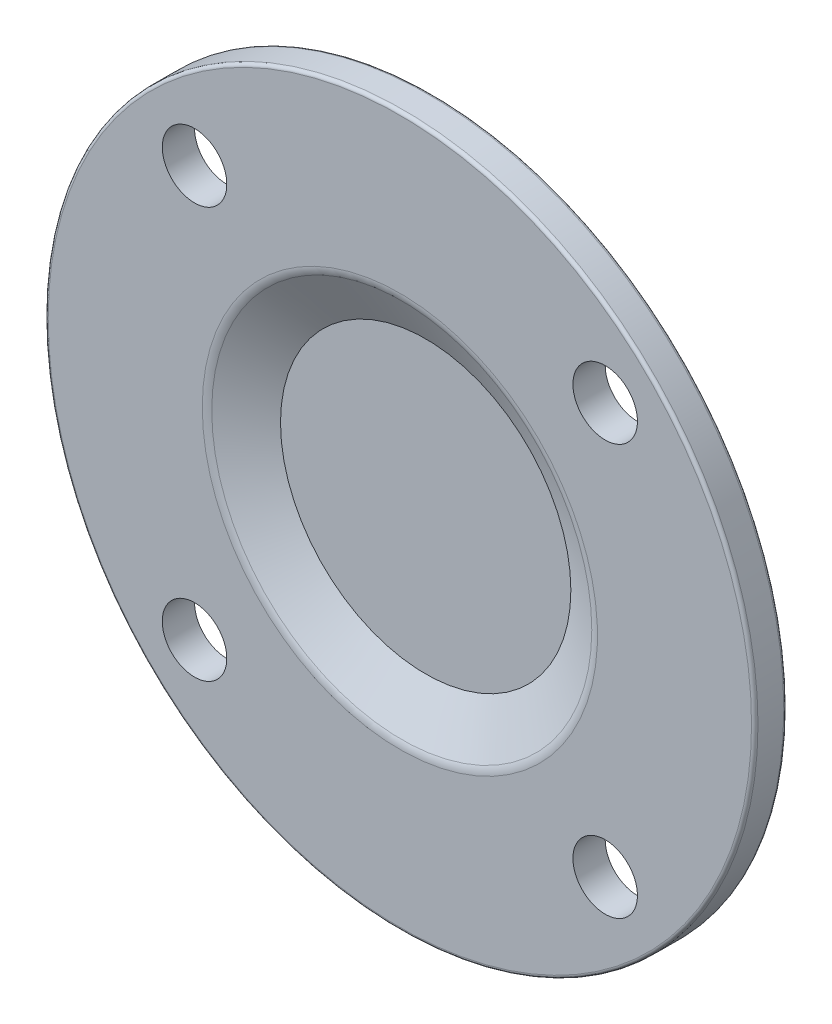
ISO-10303-21;
HEADER;
FILE_DESCRIPTION(('STEP AP214'),'2;1');
FILE_NAME('part.step','',(''),(''),'','','');
FILE_SCHEMA(('AUTOMOTIVE_DESIGN { 1 0 10303 214 1 1 1 1 }'));
ENDSEC;
DATA;
#1=APPLICATION_CONTEXT('core data for automotive mechanical design processes');
#2=APPLICATION_PROTOCOL_DEFINITION('international standard','automotive_design',2000,#1);
#3=PRODUCT_CONTEXT('',#1,'mechanical');
#4=PRODUCT('Part','Part','',(#3));
#5=PRODUCT_RELATED_PRODUCT_CATEGORY('part','',(#4));
#6=PRODUCT_DEFINITION_FORMATION('','',#4);
#7=PRODUCT_DEFINITION_CONTEXT('part definition',#1,'design');
#8=PRODUCT_DEFINITION('design','',#6,#7);
#9=PRODUCT_DEFINITION_SHAPE('','',#8);
#10=(LENGTH_UNIT() NAMED_UNIT(*) SI_UNIT(.MILLI.,.METRE.));
#11=(NAMED_UNIT(*) PLANE_ANGLE_UNIT() SI_UNIT($,.RADIAN.));
#12=(NAMED_UNIT(*) SI_UNIT($,.STERADIAN.) SOLID_ANGLE_UNIT());
#13=UNCERTAINTY_MEASURE_WITH_UNIT(LENGTH_MEASURE(1.E-05),#10,'distance_accuracy_value','');
#14=(GEOMETRIC_REPRESENTATION_CONTEXT(3) GLOBAL_UNCERTAINTY_ASSIGNED_CONTEXT((#13)) GLOBAL_UNIT_ASSIGNED_CONTEXT((#10,
#11,#12)) REPRESENTATION_CONTEXT('',''));
#15=CARTESIAN_POINT('',(0.,0.,0.));
#16=DIRECTION('',(0.,0.,1.));
#17=DIRECTION('',(1.,0.,0.));
#18=AXIS2_PLACEMENT_3D('',#15,#16,#17);
#19=CARTESIAN_POINT('',(0.,0.,0.));
#20=DIRECTION('',(0.,0.,1.));
#21=DIRECTION('',(1.,0.,0.));
#22=AXIS2_PLACEMENT_3D('',#19,#20,#21);
#23=CYLINDRICAL_SURFACE('',#22,11.);
#24=CARTESIAN_POINT('',(0.,0.,-0.1));
#25=DIRECTION('',(0.,0.,-1.));
#26=DIRECTION('',(-1.,0.,0.));
#27=AXIS2_PLACEMENT_3D('',#24,#25,#26);
#28=CIRCLE('',#27,11.);
#29=CARTESIAN_POINT('',(-11.,0.,-0.1));
#30=VERTEX_POINT('',#29);
#31=EDGE_CURVE('E37',#30,#30,#28,.T.);
#32=ORIENTED_EDGE('',*,*,#31,.T.);
#33=EDGE_LOOP('',(#32));
#34=FACE_BOUND('',#33,.T.);
#35=CARTESIAN_POINT('',(0.,0.,-0.9));
#36=DIRECTION('',(0.,0.,1.));
#37=DIRECTION('',(1.,0.,0.));
#38=AXIS2_PLACEMENT_3D('',#35,#36,#37);
#39=CIRCLE('',#38,11.);
#40=CARTESIAN_POINT('',(11.,0.,-0.9));
#41=VERTEX_POINT('',#40);
#42=EDGE_CURVE('E41',#41,#41,#39,.T.);
#43=ORIENTED_EDGE('',*,*,#42,.T.);
#44=EDGE_LOOP('',(#43));
#45=FACE_BOUND('',#44,.T.);
#46=ADVANCED_FACE('F30',(#34,#45),#23,.T.);
#47=CARTESIAN_POINT('',(0.,11.,-1.));
#48=DIRECTION('',(0.,0.,1.));
#49=DIRECTION('',(1.,0.,0.));
#50=AXIS2_PLACEMENT_3D('',#47,#48,#49);
#51=PLANE('',#50);
#52=CARTESIAN_POINT('',(0.,0.,-1.));
#53=DIRECTION('',(0.,0.,1.));
#54=DIRECTION('',(1.,0.,0.));
#55=AXIS2_PLACEMENT_3D('',#52,#53,#54);
#56=CIRCLE('',#55,10.9);
#57=CARTESIAN_POINT('',(10.9,0.,-1.));
#58=VERTEX_POINT('',#57);
#59=EDGE_CURVE('E10',#58,#58,#56,.F.);
#60=ORIENTED_EDGE('',*,*,#59,.T.);
#61=EDGE_LOOP('',(#60));
#62=FACE_BOUND('',#61,.T.);
#63=CARTESIAN_POINT('',(6.36396103067894,6.36396103067856,-1.));
#64=DIRECTION('',(0.,0.,-1.));
#65=DIRECTION('',(-1.,0.,0.));
#66=AXIS2_PLACEMENT_3D('',#63,#64,#65);
#67=CIRCLE('',#66,1.00000000000038);
#68=CARTESIAN_POINT('',(5.36396103067855,6.36396103067856,-1.));
#69=VERTEX_POINT('',#68);
#70=EDGE_CURVE('E78',#69,#69,#67,.T.);
#71=ORIENTED_EDGE('',*,*,#70,.F.);
#72=EDGE_LOOP('',(#71));
#73=FACE_BOUND('',#72,.T.);
#74=CARTESIAN_POINT('',(6.36396103067856,-6.36396103067929,-1.));
#75=DIRECTION('',(0.,0.,-1.));
#76=DIRECTION('',(-1.,0.,0.));
#77=AXIS2_PLACEMENT_3D('',#74,#75,#76);
#78=CIRCLE('',#77,1.00000000000026);
#79=CARTESIAN_POINT('',(5.36396103067829,-6.36396103067929,-1.));
#80=VERTEX_POINT('',#79);
#81=EDGE_CURVE('E84',#80,#80,#78,.T.);
#82=ORIENTED_EDGE('',*,*,#81,.F.);
#83=EDGE_LOOP('',(#82));
#84=FACE_BOUND('',#83,.T.);
#85=CARTESIAN_POINT('',(-6.36396103067929,-6.36396103067891,-1.));
#86=DIRECTION('',(0.,0.,-1.));
#87=DIRECTION('',(-1.,0.,0.));
#88=AXIS2_PLACEMENT_3D('',#85,#86,#87);
#89=CIRCLE('',#88,0.999999999999913);
#90=CARTESIAN_POINT('',(-7.3639610306792,-6.36396103067891,-1.));
#91=VERTEX_POINT('',#90);
#92=EDGE_CURVE('E90',#91,#91,#89,.T.);
#93=ORIENTED_EDGE('',*,*,#92,.F.);
#94=EDGE_LOOP('',(#93));
#95=FACE_BOUND('',#94,.T.);
#96=CARTESIAN_POINT('',(-6.36396103067892,6.36396103067894,-1.));
#97=DIRECTION('',(0.,0.,-1.));
#98=DIRECTION('',(-1.,0.,0.));
#99=AXIS2_PLACEMENT_3D('',#96,#97,#98);
#100=CIRCLE('',#99,1.);
#101=CARTESIAN_POINT('',(-7.36396103067892,6.36396103067894,-1.));
#102=VERTEX_POINT('',#101);
#103=EDGE_CURVE('E72',#102,#102,#100,.T.);
#104=ORIENTED_EDGE('',*,*,#103,.F.);
#105=EDGE_LOOP('',(#104));
#106=FACE_BOUND('',#105,.T.);
#107=CARTESIAN_POINT('',(0.,0.,-1.));
#108=DIRECTION('',(0.,0.,1.));
#109=DIRECTION('',(1.,0.,0.));
#110=AXIS2_PLACEMENT_3D('',#107,#108,#109);
#111=CIRCLE('',#110,6.125);
#112=CARTESIAN_POINT('',(6.125,0.,-1.));
#113=VERTEX_POINT('',#112);
#114=EDGE_CURVE('E59',#113,#113,#111,.T.);
#115=ORIENTED_EDGE('',*,*,#114,.T.);
#116=EDGE_LOOP('',(#115));
#117=FACE_BOUND('',#116,.T.);
#118=ADVANCED_FACE('F107',(#62,#73,#84,#95,#106,#117),#51,.F.);
#119=CARTESIAN_POINT('',(0.,0.,-1.8));
#120=DIRECTION('',(0.,0.,1.));
#121=DIRECTION('',(1.,0.,0.));
#122=AXIS2_PLACEMENT_3D('',#119,#120,#121);
#123=CONICAL_SURFACE('',#122,4.5,1.08083900054117);
#124=CARTESIAN_POINT('',(0.,0.,-1.05882352941177));
#125=DIRECTION('',(0.,0.,1.));
#126=DIRECTION('',(1.,0.,0.));
#127=AXIS2_PLACEMENT_3D('',#124,#125,#126);
#128=CIRCLE('',#127,5.88970588235294);
#129=CARTESIAN_POINT('',(5.88970588235294,0.,-1.05882352941177));
#130=VERTEX_POINT('',#129);
#131=EDGE_CURVE('E53',#130,#130,#128,.F.);
#132=ORIENTED_EDGE('',*,*,#131,.T.);
#133=EDGE_LOOP('',(#132));
#134=FACE_BOUND('',#133,.T.);
#135=CARTESIAN_POINT('',(0.,0.,-1.74117647058824));
#136=DIRECTION('',(0.,0.,-1.));
#137=DIRECTION('',(-1.,0.,0.));
#138=AXIS2_PLACEMENT_3D('',#135,#136,#137);
#139=CIRCLE('',#138,4.61029411764706);
#140=CARTESIAN_POINT('',(-4.61029411764706,0.,-1.74117647058824));
#141=VERTEX_POINT('',#140);
#142=EDGE_CURVE('E56',#141,#141,#139,.F.);
#143=ORIENTED_EDGE('',*,*,#142,.T.);
#144=EDGE_LOOP('',(#143));
#145=FACE_BOUND('',#144,.T.);
#146=ADVANCED_FACE('F110',(#134,#145),#123,.T.);
#147=CARTESIAN_POINT('',(0.,0.,-1.8));
#148=DIRECTION('',(0.,0.,1.));
#149=DIRECTION('',(1.,0.,0.));
#150=AXIS2_PLACEMENT_3D('',#147,#148,#149);
#151=PLANE('',#150);
#152=CARTESIAN_POINT('',(0.,0.,-1.8));
#153=DIRECTION('',(0.,0.,1.));
#154=DIRECTION('',(1.,0.,0.));
#155=AXIS2_PLACEMENT_3D('',#152,#153,#154);
#156=CIRCLE('',#155,4.375);
#157=CARTESIAN_POINT('',(4.375,0.,-1.8));
#158=VERTEX_POINT('',#157);
#159=EDGE_CURVE('E50',#158,#158,#156,.F.);
#160=ORIENTED_EDGE('',*,*,#159,.T.);
#161=EDGE_LOOP('',(#160));
#162=FACE_BOUND('',#161,.T.);
#163=ADVANCED_FACE('F139',(#162),#151,.F.);
#164=CARTESIAN_POINT('',(0.,0.,-0.800000000000001));
#165=DIRECTION('',(0.,0.,-1.));
#166=DIRECTION('',(-1.,0.,0.));
#167=AXIS2_PLACEMENT_3D('',#164,#165,#166);
#168=PLANE('',#167);
#169=CARTESIAN_POINT('',(0.,0.,-0.800000000000001));
#170=DIRECTION('',(0.,0.,1.));
#171=DIRECTION('',(1.,0.,0.));
#172=AXIS2_PLACEMENT_3D('',#169,#170,#171);
#173=CIRCLE('',#172,4.5);
#174=CARTESIAN_POINT('',(4.5,0.,-0.800000000000001));
#175=VERTEX_POINT('',#174);
#176=EDGE_CURVE('E68',#175,#175,#173,.T.);
#177=ORIENTED_EDGE('',*,*,#176,.T.);
#178=EDGE_LOOP('',(#177));
#179=FACE_BOUND('',#178,.T.);
#180=ADVANCED_FACE('F143',(#179),#168,.F.);
#181=CARTESIAN_POINT('',(0.,0.,0.));
#182=DIRECTION('',(0.,0.,1.));
#183=DIRECTION('',(1.,0.,0.));
#184=AXIS2_PLACEMENT_3D('',#181,#182,#183);
#185=CONICAL_SURFACE('',#184,6.,1.08083900054117);
#186=CARTESIAN_POINT('',(0.,0.,-0.0588235294117639));
#187=DIRECTION('',(0.,0.,-1.));
#188=DIRECTION('',(-1.,0.,0.));
#189=AXIS2_PLACEMENT_3D('',#186,#187,#188);
#190=CIRCLE('',#189,5.88970588235294);
#191=CARTESIAN_POINT('',(-5.88970588235294,0.,-0.0588235294117639));
#192=VERTEX_POINT('',#191);
#193=EDGE_CURVE('E65',#192,#192,#190,.F.);
#194=ORIENTED_EDGE('',*,*,#193,.T.);
#195=EDGE_LOOP('',(#194));
#196=FACE_BOUND('',#195,.T.);
#197=ORIENTED_EDGE('',*,*,#176,.F.);
#198=EDGE_LOOP('',(#197));
#199=FACE_BOUND('',#198,.T.);
#200=ADVANCED_FACE('F147',(#196,#199),#185,.F.);
#201=CARTESIAN_POINT('',(0.,11.,0.));
#202=DIRECTION('',(0.,0.,-1.));
#203=DIRECTION('',(-1.,0.,0.));
#204=AXIS2_PLACEMENT_3D('',#201,#202,#203);
#205=PLANE('',#204);
#206=CARTESIAN_POINT('',(0.,0.,0.));
#207=DIRECTION('',(0.,0.,-1.));
#208=DIRECTION('',(-1.,0.,0.));
#209=AXIS2_PLACEMENT_3D('',#206,#207,#208);
#210=CIRCLE('',#209,10.9);
#211=CARTESIAN_POINT('',(-10.9,0.,0.));
#212=VERTEX_POINT('',#211);
#213=EDGE_CURVE('E45',#212,#212,#210,.F.);
#214=ORIENTED_EDGE('',*,*,#213,.T.);
#215=EDGE_LOOP('',(#214));
#216=FACE_BOUND('',#215,.T.);
#217=CARTESIAN_POINT('',(6.36396103067894,6.36396103067856,0.));
#218=DIRECTION('',(0.,0.,-1.));
#219=DIRECTION('',(-1.,0.,0.));
#220=AXIS2_PLACEMENT_3D('',#217,#218,#219);
#221=CIRCLE('',#220,1.00000000000038);
#222=CARTESIAN_POINT('',(5.36396103067855,6.36396103067856,0.));
#223=VERTEX_POINT('',#222);
#224=EDGE_CURVE('E81',#223,#223,#221,.T.);
#225=ORIENTED_EDGE('',*,*,#224,.T.);
#226=EDGE_LOOP('',(#225));
#227=FACE_BOUND('',#226,.T.);
#228=CARTESIAN_POINT('',(6.36396103067856,-6.36396103067929,0.));
#229=DIRECTION('',(0.,0.,-1.));
#230=DIRECTION('',(-1.,0.,0.));
#231=AXIS2_PLACEMENT_3D('',#228,#229,#230);
#232=CIRCLE('',#231,1.00000000000026);
#233=CARTESIAN_POINT('',(5.36396103067829,-6.36396103067929,0.));
#234=VERTEX_POINT('',#233);
#235=EDGE_CURVE('E87',#234,#234,#232,.T.);
#236=ORIENTED_EDGE('',*,*,#235,.T.);
#237=EDGE_LOOP('',(#236));
#238=FACE_BOUND('',#237,.T.);
#239=CARTESIAN_POINT('',(-6.36396103067929,-6.36396103067891,0.));
#240=DIRECTION('',(0.,0.,-1.));
#241=DIRECTION('',(-1.,0.,0.));
#242=AXIS2_PLACEMENT_3D('',#239,#240,#241);
#243=CIRCLE('',#242,0.999999999999913);
#244=CARTESIAN_POINT('',(-7.3639610306792,-6.36396103067891,0.));
#245=VERTEX_POINT('',#244);
#246=EDGE_CURVE('E75',#245,#245,#243,.T.);
#247=ORIENTED_EDGE('',*,*,#246,.T.);
#248=EDGE_LOOP('',(#247));
#249=FACE_BOUND('',#248,.T.);
#250=CARTESIAN_POINT('',(-6.36396103067892,6.36396103067894,0.));
#251=DIRECTION('',(0.,0.,-1.));
#252=DIRECTION('',(-1.,0.,0.));
#253=AXIS2_PLACEMENT_3D('',#250,#251,#252);
#254=CIRCLE('',#253,1.);
#255=CARTESIAN_POINT('',(-7.36396103067892,6.36396103067894,0.));
#256=VERTEX_POINT('',#255);
#257=EDGE_CURVE('E71',#256,#256,#254,.T.);
#258=ORIENTED_EDGE('',*,*,#257,.T.);
#259=EDGE_LOOP('',(#258));
#260=FACE_BOUND('',#259,.T.);
#261=CARTESIAN_POINT('',(0.,0.,0.));
#262=DIRECTION('',(0.,0.,-1.));
#263=DIRECTION('',(-1.,0.,0.));
#264=AXIS2_PLACEMENT_3D('',#261,#262,#263);
#265=CIRCLE('',#264,6.125);
#266=CARTESIAN_POINT('',(-6.125,0.,0.));
#267=VERTEX_POINT('',#266);
#268=EDGE_CURVE('E62',#267,#267,#265,.T.);
#269=ORIENTED_EDGE('',*,*,#268,.T.);
#270=EDGE_LOOP('',(#269));
#271=FACE_BOUND('',#270,.T.);
#272=ADVANCED_FACE('F96',(#216,#227,#238,#249,#260,#271),#205,.F.);
#273=CARTESIAN_POINT('',(0.,0.,-0.5));
#274=DIRECTION('',(0.,0.,-1.));
#275=DIRECTION('',(-1.,0.,0.));
#276=AXIS2_PLACEMENT_3D('',#273,#274,#275);
#277=TOROIDAL_SURFACE('',#276,6.125,0.5);
#278=ORIENTED_EDGE('',*,*,#268,.F.);
#279=EDGE_LOOP('',(#278));
#280=FACE_BOUND('',#279,.T.);
#281=ORIENTED_EDGE('',*,*,#193,.F.);
#282=EDGE_LOOP('',(#281));
#283=FACE_BOUND('',#282,.T.);
#284=ADVANCED_FACE('F119',(#280,#283),#277,.T.);
#285=CARTESIAN_POINT('',(0.,0.,-1.5));
#286=DIRECTION('',(0.,0.,1.));
#287=DIRECTION('',(1.,0.,0.));
#288=AXIS2_PLACEMENT_3D('',#285,#286,#287);
#289=TOROIDAL_SURFACE('',#288,6.125,0.5);
#290=ORIENTED_EDGE('',*,*,#131,.F.);
#291=EDGE_LOOP('',(#290));
#292=FACE_BOUND('',#291,.T.);
#293=ORIENTED_EDGE('',*,*,#114,.F.);
#294=EDGE_LOOP('',(#293));
#295=FACE_BOUND('',#294,.T.);
#296=ADVANCED_FACE('F116',(#292,#295),#289,.F.);
#297=CARTESIAN_POINT('',(0.,0.,-1.3));
#298=DIRECTION('',(0.,0.,1.));
#299=DIRECTION('',(1.,0.,0.));
#300=AXIS2_PLACEMENT_3D('',#297,#298,#299);
#301=TOROIDAL_SURFACE('',#300,4.375,0.5);
#302=ORIENTED_EDGE('',*,*,#159,.F.);
#303=EDGE_LOOP('',(#302));
#304=FACE_BOUND('',#303,.T.);
#305=ORIENTED_EDGE('',*,*,#142,.F.);
#306=EDGE_LOOP('',(#305));
#307=FACE_BOUND('',#306,.T.);
#308=ADVANCED_FACE('F118',(#304,#307),#301,.T.);
#309=CARTESIAN_POINT('',(-6.36396103067892,6.36396103067894,0.));
#310=DIRECTION('',(0.,0.,-1.));
#311=DIRECTION('',(-1.,0.,0.));
#312=AXIS2_PLACEMENT_3D('',#309,#310,#311);
#313=CYLINDRICAL_SURFACE('',#312,1.);
#314=ORIENTED_EDGE('',*,*,#257,.F.);
#315=EDGE_LOOP('',(#314));
#316=FACE_BOUND('',#315,.T.);
#317=ORIENTED_EDGE('',*,*,#103,.T.);
#318=EDGE_LOOP('',(#317));
#319=FACE_BOUND('',#318,.T.);
#320=ADVANCED_FACE('F103',(#316,#319),#313,.F.);
#321=CARTESIAN_POINT('',(-6.36396103067929,-6.36396103067891,0.));
#322=DIRECTION('',(0.,0.,-1.));
#323=DIRECTION('',(-1.,0.,0.));
#324=AXIS2_PLACEMENT_3D('',#321,#322,#323);
#325=CYLINDRICAL_SURFACE('',#324,0.999999999999913);
#326=ORIENTED_EDGE('',*,*,#246,.F.);
#327=EDGE_LOOP('',(#326));
#328=FACE_BOUND('',#327,.T.);
#329=ORIENTED_EDGE('',*,*,#92,.T.);
#330=EDGE_LOOP('',(#329));
#331=FACE_BOUND('',#330,.T.);
#332=ADVANCED_FACE('F99',(#328,#331),#325,.F.);
#333=CARTESIAN_POINT('',(6.36396103067856,-6.36396103067929,0.));
#334=DIRECTION('',(0.,0.,-1.));
#335=DIRECTION('',(-1.,0.,0.));
#336=AXIS2_PLACEMENT_3D('',#333,#334,#335);
#337=CYLINDRICAL_SURFACE('',#336,1.00000000000026);
#338=ORIENTED_EDGE('',*,*,#235,.F.);
#339=EDGE_LOOP('',(#338));
#340=FACE_BOUND('',#339,.T.);
#341=ORIENTED_EDGE('',*,*,#81,.T.);
#342=EDGE_LOOP('',(#341));
#343=FACE_BOUND('',#342,.T.);
#344=ADVANCED_FACE('F102',(#340,#343),#337,.F.);
#345=CARTESIAN_POINT('',(6.36396103067894,6.36396103067856,0.));
#346=DIRECTION('',(0.,0.,-1.));
#347=DIRECTION('',(-1.,0.,0.));
#348=AXIS2_PLACEMENT_3D('',#345,#346,#347);
#349=CYLINDRICAL_SURFACE('',#348,1.00000000000038);
#350=ORIENTED_EDGE('',*,*,#224,.F.);
#351=EDGE_LOOP('',(#350));
#352=FACE_BOUND('',#351,.T.);
#353=ORIENTED_EDGE('',*,*,#70,.T.);
#354=EDGE_LOOP('',(#353));
#355=FACE_BOUND('',#354,.T.);
#356=ADVANCED_FACE('F158',(#352,#355),#349,.F.);
#357=CARTESIAN_POINT('',(0.,0.,-0.1));
#358=DIRECTION('',(0.,0.,-1.));
#359=DIRECTION('',(-1.,0.,0.));
#360=AXIS2_PLACEMENT_3D('',#357,#358,#359);
#361=TOROIDAL_SURFACE('',#360,10.9,0.1);
#362=ORIENTED_EDGE('',*,*,#31,.F.);
#363=EDGE_LOOP('',(#362));
#364=FACE_BOUND('',#363,.T.);
#365=ORIENTED_EDGE('',*,*,#213,.F.);
#366=EDGE_LOOP('',(#365));
#367=FACE_BOUND('',#366,.T.);
#368=ADVANCED_FACE('F161',(#364,#367),#361,.T.);
#369=CARTESIAN_POINT('',(0.,0.,-0.9));
#370=DIRECTION('',(0.,0.,1.));
#371=DIRECTION('',(1.,0.,0.));
#372=AXIS2_PLACEMENT_3D('',#369,#370,#371);
#373=TOROIDAL_SURFACE('',#372,10.9,0.1);
#374=ORIENTED_EDGE('',*,*,#59,.F.);
#375=EDGE_LOOP('',(#374));
#376=FACE_BOUND('',#375,.T.);
#377=ORIENTED_EDGE('',*,*,#42,.F.);
#378=EDGE_LOOP('',(#377));
#379=FACE_BOUND('',#378,.T.);
#380=ADVANCED_FACE('F32',(#376,#379),#373,.T.);
#381=CLOSED_SHELL('',(#46,#118,#146,#163,#180,#200,#272,#284,#296,#308,#320,#332,#344,#356,#368,#380));
#382=MANIFOLD_SOLID_BREP('B2',#381);
#383=ADVANCED_BREP_SHAPE_REPRESENTATION('',(#18,#382),#14);
#384=SHAPE_DEFINITION_REPRESENTATION(#9,#383);
ENDSEC;
END-ISO-10303-21;
